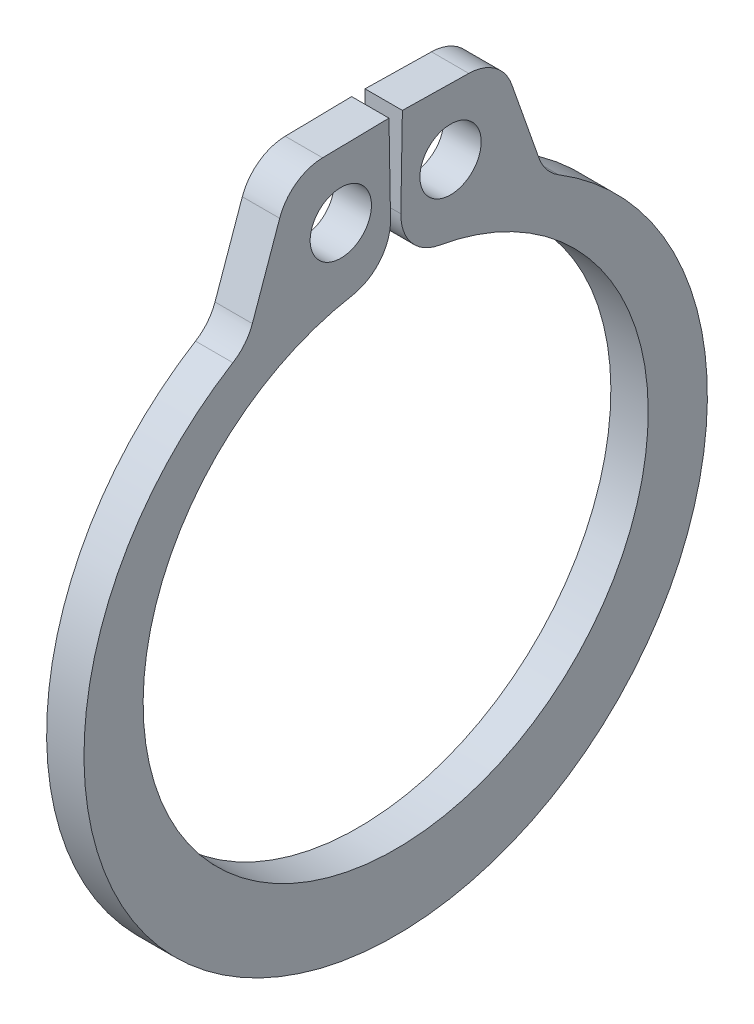
ISO-10303-21;
HEADER;
FILE_DESCRIPTION(('STEP AP214'),'2;1');
FILE_NAME('part.step','',(''),(''),'','','');
FILE_SCHEMA(('AUTOMOTIVE_DESIGN { 1 0 10303 214 1 1 1 1 }'));
ENDSEC;
DATA;
#1=APPLICATION_CONTEXT('core data for automotive mechanical design processes');
#2=APPLICATION_PROTOCOL_DEFINITION('international standard','automotive_design',2000,#1);
#3=PRODUCT_CONTEXT('',#1,'mechanical');
#4=PRODUCT('Part','Part','',(#3));
#5=PRODUCT_RELATED_PRODUCT_CATEGORY('part','',(#4));
#6=PRODUCT_DEFINITION_FORMATION('','',#4);
#7=PRODUCT_DEFINITION_CONTEXT('part definition',#1,'design');
#8=PRODUCT_DEFINITION('design','',#6,#7);
#9=PRODUCT_DEFINITION_SHAPE('','',#8);
#10=(LENGTH_UNIT() NAMED_UNIT(*) SI_UNIT(.MILLI.,.METRE.));
#11=(NAMED_UNIT(*) PLANE_ANGLE_UNIT() SI_UNIT($,.RADIAN.));
#12=(NAMED_UNIT(*) SI_UNIT($,.STERADIAN.) SOLID_ANGLE_UNIT());
#13=UNCERTAINTY_MEASURE_WITH_UNIT(LENGTH_MEASURE(1.E-05),#10,'distance_accuracy_value','');
#14=(GEOMETRIC_REPRESENTATION_CONTEXT(3) GLOBAL_UNCERTAINTY_ASSIGNED_CONTEXT((#13)) GLOBAL_UNIT_ASSIGNED_CONTEXT((#10,
#11,#12)) REPRESENTATION_CONTEXT('',''));
#15=CARTESIAN_POINT('',(0.,0.,0.));
#16=DIRECTION('',(0.,0.,1.));
#17=DIRECTION('',(1.,0.,0.));
#18=AXIS2_PLACEMENT_3D('',#15,#16,#17);
#19=CARTESIAN_POINT('',(0.3175,-0.264524901465114,0.));
#20=DIRECTION('',(1.,0.,0.));
#21=DIRECTION('',(0.,0.,-1.));
#22=AXIS2_PLACEMENT_3D('',#19,#20,#21);
#23=PLANE('',#22);
#24=CARTESIAN_POINT('',(0.3175,5.39474739325938,0.932493347387079));
#25=DIRECTION('',(1.,0.,0.));
#26=DIRECTION('',(0.,0.,-1.));
#27=AXIS2_PLACEMENT_3D('',#24,#25,#26);
#28=CIRCLE('',#27,0.5207);
#29=CARTESIAN_POINT('',(0.3175,5.39474739325938,0.411793347387079));
#30=VERTEX_POINT('',#29);
#31=EDGE_CURVE('E178',#30,#30,#28,.T.);
#32=ORIENTED_EDGE('',*,*,#31,.F.);
#33=EDGE_LOOP('',(#32));
#34=FACE_BOUND('',#33,.T.);
#35=DIRECTION('',(0.,0.943255355198257,0.332068268417521));
#36=VECTOR('',#35,1.);
#37=CARTESIAN_POINT('',(0.3175,6.49754857029043,-1.79007049490147));
#38=LINE('',#37,#36);
#39=CARTESIAN_POINT('',(0.3175,4.66344515220108,-2.43575731002226));
#40=VERTEX_POINT('',#39);
#41=CARTESIAN_POINT('',(0.3175,5.98129100900124,-1.97181635352819));
#42=VERTEX_POINT('',#41);
#43=EDGE_CURVE('E184',#40,#42,#38,.T.);
#44=ORIENTED_EDGE('',*,*,#43,.T.);
#45=CARTESIAN_POINT('',(0.3175,5.71982045444928,-1.22909708684508));
#46=DIRECTION('',(1.,0.,0.));
#47=DIRECTION('',(0.,0.,-1.));
#48=AXIS2_PLACEMENT_3D('',#45,#46,#47);
#49=CIRCLE('',#48,0.7874);
#50=CARTESIAN_POINT('',(0.3175,6.50710052961543,-1.2428391116738));
#51=VERTEX_POINT('',#50);
#52=EDGE_CURVE('E223',#42,#51,#49,.T.);
#53=ORIENTED_EDGE('',*,*,#52,.T.);
#54=DIRECTION('',(0.,0.0174524064372838,0.999847695156391));
#55=VECTOR('',#54,1.);
#56=CARTESIAN_POINT('',(0.3175,6.52680578444189,-0.113925818741299));
#57=LINE('',#56,#55);
#58=CARTESIAN_POINT('',(0.3175,6.52680578444189,-0.113925818741299));
#59=VERTEX_POINT('',#58);
#60=EDGE_CURVE('E187',#51,#59,#57,.T.);
#61=ORIENTED_EDGE('',*,*,#60,.T.);
#62=DIRECTION('',(0.,-0.999847695156391,0.0174524064372837));
#63=VECTOR('',#62,1.);
#64=CARTESIAN_POINT('',(0.3175,4.29194621622833,-0.0749161998726827));
#65=LINE('',#64,#63);
#66=CARTESIAN_POINT('',(0.3175,5.01784114958208,-0.0875867430654367));
#67=VERTEX_POINT('',#66);
#68=EDGE_CURVE('E155',#59,#67,#65,.T.);
#69=ORIENTED_EDGE('',*,*,#68,.T.);
#70=CARTESIAN_POINT('',(0.3175,5.00409912475336,-0.874866818231579));
#71=DIRECTION('',(1.,0.,0.));
#72=DIRECTION('',(0.,0.,-1.));
#73=AXIS2_PLACEMENT_3D('',#70,#71,#72);
#74=CIRCLE('',#73,0.7874);
#75=CARTESIAN_POINT('',(0.3175,4.22846376041659,-0.739262461405685));
#76=VERTEX_POINT('',#75);
#77=EDGE_CURVE('E221',#67,#76,#74,.T.);
#78=ORIENTED_EDGE('',*,*,#77,.T.);
#79=CARTESIAN_POINT('',(0.3175,0.,0.));
#80=DIRECTION('',(-1.,0.,0.));
#81=DIRECTION('',(0.,0.,-1.));
#82=AXIS2_PLACEMENT_3D('',#79,#80,#81);
#83=CIRCLE('',#82,4.2926);
#84=CARTESIAN_POINT('',(0.3175,4.22846376041659,0.739262461405685));
#85=VERTEX_POINT('',#84);
#86=EDGE_CURVE('E190',#76,#85,#83,.T.);
#87=ORIENTED_EDGE('',*,*,#86,.T.);
#88=CARTESIAN_POINT('',(0.3175,5.00409912475336,0.874866818231579));
#89=DIRECTION('',(1.,0.,0.));
#90=DIRECTION('',(0.,0.,-1.));
#91=AXIS2_PLACEMENT_3D('',#88,#89,#90);
#92=CIRCLE('',#91,0.7874);
#93=CARTESIAN_POINT('',(0.3175,5.01784114958208,0.087586743065437));
#94=VERTEX_POINT('',#93);
#95=EDGE_CURVE('E219',#85,#94,#92,.T.);
#96=ORIENTED_EDGE('',*,*,#95,.T.);
#97=DIRECTION('',(0.,0.999847695156391,0.0174524064372835));
#98=VECTOR('',#97,1.);
#99=CARTESIAN_POINT('',(0.3175,4.29194621622833,0.0749161998726831));
#100=LINE('',#99,#98);
#101=CARTESIAN_POINT('',(0.3175,6.52680578444189,0.113925818741299));
#102=VERTEX_POINT('',#101);
#103=EDGE_CURVE('E193',#94,#102,#100,.T.);
#104=ORIENTED_EDGE('',*,*,#103,.T.);
#105=DIRECTION('',(0.,-0.0174524064372838,0.999847695156391));
#106=VECTOR('',#105,1.);
#107=CARTESIAN_POINT('',(0.3175,6.52680578444189,0.113925818741299));
#108=LINE('',#107,#106);
#109=CARTESIAN_POINT('',(0.3175,6.50710052961543,1.2428391116738));
#110=VERTEX_POINT('',#109);
#111=EDGE_CURVE('E195',#102,#110,#108,.T.);
#112=ORIENTED_EDGE('',*,*,#111,.T.);
#113=CARTESIAN_POINT('',(0.3175,5.71982045444928,1.22909708684508));
#114=DIRECTION('',(1.,0.,0.));
#115=DIRECTION('',(0.,0.,-1.));
#116=AXIS2_PLACEMENT_3D('',#113,#114,#115);
#117=CIRCLE('',#116,0.7874);
#118=CARTESIAN_POINT('',(0.3175,5.98129100900124,1.97181635352819));
#119=VERTEX_POINT('',#118);
#120=EDGE_CURVE('E56',#110,#119,#117,.T.);
#121=ORIENTED_EDGE('',*,*,#120,.T.);
#122=DIRECTION('',(0.,-0.943255355198257,0.33206826841752));
#123=VECTOR('',#122,1.);
#124=CARTESIAN_POINT('',(0.3175,6.49754857029043,1.79007049490147));
#125=LINE('',#124,#123);
#126=CARTESIAN_POINT('',(0.3175,4.66344515220108,2.43575731002226));
#127=VERTEX_POINT('',#126);
#128=EDGE_CURVE('E197',#119,#127,#125,.T.);
#129=ORIENTED_EDGE('',*,*,#128,.T.);
#130=CARTESIAN_POINT('',(0.3175,4.92491570675304,3.17847657670536));
#131=DIRECTION('',(1.,0.,0.));
#132=DIRECTION('',(0.,0.,-1.));
#133=AXIS2_PLACEMENT_3D('',#130,#131,#132);
#134=CIRCLE('',#133,0.7874);
#135=CARTESIAN_POINT('',(0.3175,4.25345366496525,2.76721329553602));
#136=VERTEX_POINT('',#135);
#137=EDGE_CURVE('E11',#127,#136,#134,.F.);
#138=ORIENTED_EDGE('',*,*,#137,.T.);
#139=CARTESIAN_POINT('',(0.3175,-0.264524901465114,0.));
#140=DIRECTION('',(1.,0.,0.));
#141=DIRECTION('',(0.,0.,-1.));
#142=AXIS2_PLACEMENT_3D('',#139,#140,#141);
#143=CIRCLE('',#142,5.29807509853489);
#144=CARTESIAN_POINT('',(0.3175,4.25345366496525,-2.76721329553602));
#145=VERTEX_POINT('',#144);
#146=EDGE_CURVE('E181',#136,#145,#143,.T.);
#147=ORIENTED_EDGE('',*,*,#146,.T.);
#148=CARTESIAN_POINT('',(0.3175,4.92491570675304,-3.17847657670536));
#149=DIRECTION('',(1.,0.,0.));
#150=DIRECTION('',(0.,0.,-1.));
#151=AXIS2_PLACEMENT_3D('',#148,#149,#150);
#152=CIRCLE('',#151,0.7874);
#153=EDGE_CURVE('E243',#145,#40,#152,.F.);
#154=ORIENTED_EDGE('',*,*,#153,.T.);
#155=EDGE_LOOP('',(#44,#53,#61,#69,#78,#87,#96,#104,#112,#121,#129,#138,#147,#154));
#156=FACE_BOUND('',#155,.T.);
#157=CARTESIAN_POINT('',(0.3175,5.39474739325938,-0.932493347387079));
#158=DIRECTION('',(1.,0.,0.));
#159=DIRECTION('',(0.,0.,-1.));
#160=AXIS2_PLACEMENT_3D('',#157,#158,#159);
#161=CIRCLE('',#160,0.5207);
#162=CARTESIAN_POINT('',(0.3175,5.39474739325938,-1.45319334738708));
#163=VERTEX_POINT('',#162);
#164=EDGE_CURVE('E175',#163,#163,#161,.T.);
#165=ORIENTED_EDGE('',*,*,#164,.F.);
#166=EDGE_LOOP('',(#165));
#167=FACE_BOUND('',#166,.T.);
#168=ADVANCED_FACE('F34',(#34,#156,#167),#23,.T.);
#169=CARTESIAN_POINT('',(0.3175,-0.264524901465114,0.));
#170=DIRECTION('',(-1.,0.,0.));
#171=DIRECTION('',(0.,0.,1.));
#172=AXIS2_PLACEMENT_3D('',#169,#170,#171);
#173=CYLINDRICAL_SURFACE('',#172,5.29807509853489);
#174=CARTESIAN_POINT('',(-0.3175,-0.264524901465114,0.));
#175=DIRECTION('',(1.,0.,0.));
#176=DIRECTION('',(0.,0.,-1.));
#177=AXIS2_PLACEMENT_3D('',#174,#175,#176);
#178=CIRCLE('',#177,5.29807509853489);
#179=CARTESIAN_POINT('',(-0.3175,4.25345366496525,2.76721329553602));
#180=VERTEX_POINT('',#179);
#181=CARTESIAN_POINT('',(-0.3175,4.25345366496525,-2.76721329553602));
#182=VERTEX_POINT('',#181);
#183=EDGE_CURVE('E247',#180,#182,#178,.T.);
#184=ORIENTED_EDGE('',*,*,#183,.T.);
#185=DIRECTION('',(-1.,0.,0.));
#186=VECTOR('',#185,1.);
#187=CARTESIAN_POINT('',(0.3175,4.25345366496525,-2.76721329553602));
#188=LINE('',#187,#186);
#189=EDGE_CURVE('E208',#182,#145,#188,.F.);
#190=ORIENTED_EDGE('',*,*,#189,.T.);
#191=ORIENTED_EDGE('',*,*,#146,.F.);
#192=DIRECTION('',(-1.,0.,0.));
#193=VECTOR('',#192,1.);
#194=CARTESIAN_POINT('',(0.3175,4.25345366496525,2.76721329553602));
#195=LINE('',#194,#193);
#196=EDGE_CURVE('E205',#136,#180,#195,.T.);
#197=ORIENTED_EDGE('',*,*,#196,.T.);
#198=EDGE_LOOP('',(#184,#190,#191,#197));
#199=FACE_BOUND('',#198,.T.);
#200=ADVANCED_FACE('F257',(#199),#173,.T.);
#201=CARTESIAN_POINT('',(0.3175,6.49754857029043,-1.79007049490147));
#202=DIRECTION('',(0.,-0.332068268417521,0.943255355198257));
#203=DIRECTION('',(0.,-0.943255355198257,-0.332068268417521));
#204=AXIS2_PLACEMENT_3D('',#201,#202,#203);
#205=PLANE('',#204);
#206=ORIENTED_EDGE('',*,*,#43,.F.);
#207=DIRECTION('',(1.,0.,0.));
#208=VECTOR('',#207,1.);
#209=CARTESIAN_POINT('',(-0.3175,4.66344515220108,-2.43575731002226));
#210=LINE('',#209,#208);
#211=CARTESIAN_POINT('',(-0.3175,4.66344515220108,-2.43575731002226));
#212=VERTEX_POINT('',#211);
#213=EDGE_CURVE('E202',#40,#212,#210,.F.);
#214=ORIENTED_EDGE('',*,*,#213,.T.);
#215=DIRECTION('',(0.,0.943255355198257,0.332068268417521));
#216=VECTOR('',#215,1.);
#217=CARTESIAN_POINT('',(-0.3175,6.49754857029043,-1.79007049490147));
#218=LINE('',#217,#216);
#219=CARTESIAN_POINT('',(-0.3175,5.98129100900124,-1.97181635352819));
#220=VERTEX_POINT('',#219);
#221=EDGE_CURVE('E148',#212,#220,#218,.T.);
#222=ORIENTED_EDGE('',*,*,#221,.T.);
#223=DIRECTION('',(-1.,0.,0.));
#224=VECTOR('',#223,1.);
#225=CARTESIAN_POINT('',(0.3175,5.98129100900124,-1.97181635352819));
#226=LINE('',#225,#224);
#227=EDGE_CURVE('E156',#220,#42,#226,.F.);
#228=ORIENTED_EDGE('',*,*,#227,.T.);
#229=EDGE_LOOP('',(#206,#214,#222,#228));
#230=FACE_BOUND('',#229,.T.);
#231=ADVANCED_FACE('F265',(#230),#205,.F.);
#232=CARTESIAN_POINT('',(0.3175,6.52680578444189,-0.113925818741299));
#233=DIRECTION('',(0.,-0.999847695156391,0.0174524064372838));
#234=DIRECTION('',(0.,-0.0174524064372838,-0.999847695156391));
#235=AXIS2_PLACEMENT_3D('',#232,#233,#234);
#236=PLANE('',#235);
#237=ORIENTED_EDGE('',*,*,#60,.F.);
#238=DIRECTION('',(-1.,0.,0.));
#239=VECTOR('',#238,1.);
#240=CARTESIAN_POINT('',(0.3175,6.50710052961543,-1.2428391116738));
#241=LINE('',#240,#239);
#242=CARTESIAN_POINT('',(-0.3175,6.50710052961543,-1.2428391116738));
#243=VERTEX_POINT('',#242);
#244=EDGE_CURVE('E144',#51,#243,#241,.T.);
#245=ORIENTED_EDGE('',*,*,#244,.T.);
#246=DIRECTION('',(0.,0.0174524064372838,0.999847695156391));
#247=VECTOR('',#246,1.);
#248=CARTESIAN_POINT('',(-0.3175,6.52680578444189,-0.113925818741299));
#249=LINE('',#248,#247);
#250=CARTESIAN_POINT('',(-0.3175,6.52680578444189,-0.113925818741299));
#251=VERTEX_POINT('',#250);
#252=EDGE_CURVE('E137',#243,#251,#249,.T.);
#253=ORIENTED_EDGE('',*,*,#252,.T.);
#254=DIRECTION('',(-1.,0.,0.));
#255=VECTOR('',#254,1.);
#256=CARTESIAN_POINT('',(0.3175,6.52680578444189,-0.113925818741299));
#257=LINE('',#256,#255);
#258=EDGE_CURVE('E141',#59,#251,#257,.T.);
#259=ORIENTED_EDGE('',*,*,#258,.F.);
#260=EDGE_LOOP('',(#237,#245,#253,#259));
#261=FACE_BOUND('',#260,.T.);
#262=ADVANCED_FACE('F140',(#261),#236,.F.);
#263=CARTESIAN_POINT('',(0.3175,4.29194621622833,-0.0749161998726827));
#264=DIRECTION('',(0.,-0.0174524064372837,-0.999847695156391));
#265=DIRECTION('',(0.,0.999847695156391,-0.0174524064372837));
#266=AXIS2_PLACEMENT_3D('',#263,#264,#265);
#267=PLANE('',#266);
#268=DIRECTION('',(0.,-0.999847695156391,0.0174524064372837));
#269=VECTOR('',#268,1.);
#270=CARTESIAN_POINT('',(-0.3175,4.29194621622833,-0.0749161998726827));
#271=LINE('',#270,#269);
#272=CARTESIAN_POINT('',(-0.3175,5.01784114958208,-0.0875867430654367));
#273=VERTEX_POINT('',#272);
#274=EDGE_CURVE('E147',#251,#273,#271,.T.);
#275=ORIENTED_EDGE('',*,*,#274,.T.);
#276=DIRECTION('',(-1.,0.,0.));
#277=VECTOR('',#276,1.);
#278=CARTESIAN_POINT('',(0.3175,5.01784114958208,-0.0875867430654367));
#279=LINE('',#278,#277);
#280=EDGE_CURVE('E230',#273,#67,#279,.F.);
#281=ORIENTED_EDGE('',*,*,#280,.T.);
#282=ORIENTED_EDGE('',*,*,#68,.F.);
#283=ORIENTED_EDGE('',*,*,#258,.T.);
#284=EDGE_LOOP('',(#275,#281,#282,#283));
#285=FACE_BOUND('',#284,.T.);
#286=ADVANCED_FACE('F152',(#285),#267,.F.);
#287=CARTESIAN_POINT('',(0.3175,0.,0.));
#288=DIRECTION('',(-1.,0.,0.));
#289=DIRECTION('',(0.,0.,1.));
#290=AXIS2_PLACEMENT_3D('',#287,#288,#289);
#291=CYLINDRICAL_SURFACE('',#290,4.2926);
#292=ORIENTED_EDGE('',*,*,#86,.F.);
#293=DIRECTION('',(-1.,0.,0.));
#294=VECTOR('',#293,1.);
#295=CARTESIAN_POINT('',(0.3175,4.22846376041659,-0.739262461405685));
#296=LINE('',#295,#294);
#297=CARTESIAN_POINT('',(-0.3175,4.22846376041659,-0.739262461405685));
#298=VERTEX_POINT('',#297);
#299=EDGE_CURVE('E227',#76,#298,#296,.T.);
#300=ORIENTED_EDGE('',*,*,#299,.T.);
#301=CARTESIAN_POINT('',(-0.3175,0.,0.));
#302=DIRECTION('',(-1.,0.,0.));
#303=DIRECTION('',(0.,0.,-1.));
#304=AXIS2_PLACEMENT_3D('',#301,#302,#303);
#305=CIRCLE('',#304,4.2926);
#306=CARTESIAN_POINT('',(-0.3175,4.22846376041659,0.739262461405685));
#307=VERTEX_POINT('',#306);
#308=EDGE_CURVE('E162',#298,#307,#305,.T.);
#309=ORIENTED_EDGE('',*,*,#308,.T.);
#310=DIRECTION('',(-1.,0.,0.));
#311=VECTOR('',#310,1.);
#312=CARTESIAN_POINT('',(0.3175,4.22846376041659,0.739262461405685));
#313=LINE('',#312,#311);
#314=EDGE_CURVE('E225',#307,#85,#313,.F.);
#315=ORIENTED_EDGE('',*,*,#314,.T.);
#316=EDGE_LOOP('',(#292,#300,#309,#315));
#317=FACE_BOUND('',#316,.T.);
#318=ADVANCED_FACE('F277',(#317),#291,.F.);
#319=CARTESIAN_POINT('',(0.3175,4.29194621622833,0.0749161998726831));
#320=DIRECTION('',(0.,-0.0174524064372835,0.999847695156391));
#321=DIRECTION('',(0.,-0.999847695156391,-0.0174524064372835));
#322=AXIS2_PLACEMENT_3D('',#319,#320,#321);
#323=PLANE('',#322);
#324=ORIENTED_EDGE('',*,*,#103,.F.);
#325=DIRECTION('',(-1.,0.,0.));
#326=VECTOR('',#325,1.);
#327=CARTESIAN_POINT('',(0.3175,5.01784114958208,0.087586743065437));
#328=LINE('',#327,#326);
#329=CARTESIAN_POINT('',(-0.3175,5.01784114958208,0.087586743065437));
#330=VERTEX_POINT('',#329);
#331=EDGE_CURVE('E232',#94,#330,#328,.T.);
#332=ORIENTED_EDGE('',*,*,#331,.T.);
#333=DIRECTION('',(0.,0.999847695156391,0.0174524064372835));
#334=VECTOR('',#333,1.);
#335=CARTESIAN_POINT('',(-0.3175,4.29194621622833,0.0749161998726831));
#336=LINE('',#335,#334);
#337=CARTESIAN_POINT('',(-0.3175,6.52680578444189,0.113925818741299));
#338=VERTEX_POINT('',#337);
#339=EDGE_CURVE('E165',#330,#338,#336,.T.);
#340=ORIENTED_EDGE('',*,*,#339,.T.);
#341=DIRECTION('',(-1.,0.,0.));
#342=VECTOR('',#341,1.);
#343=CARTESIAN_POINT('',(0.3175,6.52680578444189,0.113925818741299));
#344=LINE('',#343,#342);
#345=EDGE_CURVE('E157',#102,#338,#344,.T.);
#346=ORIENTED_EDGE('',*,*,#345,.F.);
#347=EDGE_LOOP('',(#324,#332,#340,#346));
#348=FACE_BOUND('',#347,.T.);
#349=ADVANCED_FACE('F287',(#348),#323,.F.);
#350=CARTESIAN_POINT('',(0.3175,6.52680578444189,0.113925818741299));
#351=DIRECTION('',(0.,-0.999847695156391,-0.0174524064372838));
#352=DIRECTION('',(0.,0.0174524064372838,-0.999847695156391));
#353=AXIS2_PLACEMENT_3D('',#350,#351,#352);
#354=PLANE('',#353);
#355=DIRECTION('',(0.,-0.0174524064372838,0.999847695156391));
#356=VECTOR('',#355,1.);
#357=CARTESIAN_POINT('',(-0.3175,6.52680578444189,0.113925818741299));
#358=LINE('',#357,#356);
#359=CARTESIAN_POINT('',(-0.3175,6.50710052961543,1.2428391116738));
#360=VERTEX_POINT('',#359);
#361=EDGE_CURVE('E170',#338,#360,#358,.T.);
#362=ORIENTED_EDGE('',*,*,#361,.T.);
#363=DIRECTION('',(-1.,0.,0.));
#364=VECTOR('',#363,1.);
#365=CARTESIAN_POINT('',(0.3175,6.50710052961543,1.2428391116738));
#366=LINE('',#365,#364);
#367=EDGE_CURVE('E239',#360,#110,#366,.F.);
#368=ORIENTED_EDGE('',*,*,#367,.T.);
#369=ORIENTED_EDGE('',*,*,#111,.F.);
#370=ORIENTED_EDGE('',*,*,#345,.T.);
#371=EDGE_LOOP('',(#362,#368,#369,#370));
#372=FACE_BOUND('',#371,.T.);
#373=ADVANCED_FACE('F294',(#372),#354,.F.);
#374=CARTESIAN_POINT('',(0.3175,6.49754857029043,1.79007049490147));
#375=DIRECTION('',(0.,-0.33206826841752,-0.943255355198257));
#376=DIRECTION('',(0.,0.943255355198257,-0.332068268417521));
#377=AXIS2_PLACEMENT_3D('',#374,#375,#376);
#378=PLANE('',#377);
#379=ORIENTED_EDGE('',*,*,#128,.F.);
#380=DIRECTION('',(-1.,0.,0.));
#381=VECTOR('',#380,1.);
#382=CARTESIAN_POINT('',(0.3175,5.98129100900124,1.97181635352819));
#383=LINE('',#382,#381);
#384=CARTESIAN_POINT('',(-0.3175,5.98129100900124,1.97181635352819));
#385=VERTEX_POINT('',#384);
#386=EDGE_CURVE('E236',#119,#385,#383,.T.);
#387=ORIENTED_EDGE('',*,*,#386,.T.);
#388=DIRECTION('',(0.,-0.943255355198257,0.33206826841752));
#389=VECTOR('',#388,1.);
#390=CARTESIAN_POINT('',(-0.3175,6.49754857029043,1.79007049490147));
#391=LINE('',#390,#389);
#392=CARTESIAN_POINT('',(-0.3175,4.66344515220108,2.43575731002226));
#393=VERTEX_POINT('',#392);
#394=EDGE_CURVE('E173',#385,#393,#391,.T.);
#395=ORIENTED_EDGE('',*,*,#394,.T.);
#396=DIRECTION('',(1.,0.,0.));
#397=VECTOR('',#396,1.);
#398=CARTESIAN_POINT('',(0.3175,4.66344515220108,2.43575731002226));
#399=LINE('',#398,#397);
#400=EDGE_CURVE('E49',#393,#127,#399,.T.);
#401=ORIENTED_EDGE('',*,*,#400,.T.);
#402=EDGE_LOOP('',(#379,#387,#395,#401));
#403=FACE_BOUND('',#402,.T.);
#404=ADVANCED_FACE('F250',(#403),#378,.F.);
#405=CARTESIAN_POINT('',(0.3175,5.39474739325938,0.932493347387079));
#406=DIRECTION('',(-1.,0.,0.));
#407=DIRECTION('',(0.,0.,1.));
#408=AXIS2_PLACEMENT_3D('',#405,#406,#407);
#409=CYLINDRICAL_SURFACE('',#408,0.5207);
#410=ORIENTED_EDGE('',*,*,#31,.T.);
#411=EDGE_LOOP('',(#410));
#412=FACE_BOUND('',#411,.T.);
#413=CARTESIAN_POINT('',(-0.3175,5.39474739325938,0.932493347387079));
#414=DIRECTION('',(1.,0.,0.));
#415=DIRECTION('',(0.,0.,-1.));
#416=AXIS2_PLACEMENT_3D('',#413,#414,#415);
#417=CIRCLE('',#416,0.5207);
#418=CARTESIAN_POINT('',(-0.3175,5.39474739325938,0.411793347387079));
#419=VERTEX_POINT('',#418);
#420=EDGE_CURVE('E332',#419,#419,#417,.T.);
#421=ORIENTED_EDGE('',*,*,#420,.F.);
#422=EDGE_LOOP('',(#421));
#423=FACE_BOUND('',#422,.T.);
#424=ADVANCED_FACE('F301',(#412,#423),#409,.F.);
#425=CARTESIAN_POINT('',(0.3175,5.39474739325938,-0.932493347387079));
#426=DIRECTION('',(-1.,0.,0.));
#427=DIRECTION('',(0.,0.,1.));
#428=AXIS2_PLACEMENT_3D('',#425,#426,#427);
#429=CYLINDRICAL_SURFACE('',#428,0.5207);
#430=ORIENTED_EDGE('',*,*,#164,.T.);
#431=EDGE_LOOP('',(#430));
#432=FACE_BOUND('',#431,.T.);
#433=CARTESIAN_POINT('',(-0.3175,5.39474739325938,-0.932493347387079));
#434=DIRECTION('',(1.,0.,0.));
#435=DIRECTION('',(0.,0.,-1.));
#436=AXIS2_PLACEMENT_3D('',#433,#434,#435);
#437=CIRCLE('',#436,0.5207);
#438=CARTESIAN_POINT('',(-0.3175,5.39474739325938,-1.45319334738708));
#439=VERTEX_POINT('',#438);
#440=EDGE_CURVE('E329',#439,#439,#437,.T.);
#441=ORIENTED_EDGE('',*,*,#440,.F.);
#442=EDGE_LOOP('',(#441));
#443=FACE_BOUND('',#442,.T.);
#444=ADVANCED_FACE('F315',(#432,#443),#429,.F.);
#445=CARTESIAN_POINT('',(-0.3175,-0.264524901465114,0.));
#446=DIRECTION('',(1.,0.,0.));
#447=DIRECTION('',(0.,0.,-1.));
#448=AXIS2_PLACEMENT_3D('',#445,#446,#447);
#449=PLANE('',#448);
#450=ORIENTED_EDGE('',*,*,#440,.T.);
#451=EDGE_LOOP('',(#450));
#452=FACE_BOUND('',#451,.T.);
#453=ORIENTED_EDGE('',*,*,#420,.T.);
#454=EDGE_LOOP('',(#453));
#455=FACE_BOUND('',#454,.T.);
#456=ORIENTED_EDGE('',*,*,#252,.F.);
#457=CARTESIAN_POINT('',(-0.3175,5.71982045444928,-1.22909708684508));
#458=DIRECTION('',(1.,0.,0.));
#459=DIRECTION('',(0.,0.,-1.));
#460=AXIS2_PLACEMENT_3D('',#457,#458,#459);
#461=CIRCLE('',#460,0.7874);
#462=EDGE_CURVE('E216',#243,#220,#461,.F.);
#463=ORIENTED_EDGE('',*,*,#462,.T.);
#464=ORIENTED_EDGE('',*,*,#221,.F.);
#465=CARTESIAN_POINT('',(-0.3175,4.92491570675304,-3.17847657670536));
#466=DIRECTION('',(1.,0.,0.));
#467=DIRECTION('',(0.,0.,-1.));
#468=AXIS2_PLACEMENT_3D('',#465,#466,#467);
#469=CIRCLE('',#468,0.7874);
#470=EDGE_CURVE('E241',#212,#182,#469,.T.);
#471=ORIENTED_EDGE('',*,*,#470,.T.);
#472=ORIENTED_EDGE('',*,*,#183,.F.);
#473=CARTESIAN_POINT('',(-0.3175,4.92491570675304,3.17847657670536));
#474=DIRECTION('',(1.,0.,0.));
#475=DIRECTION('',(0.,0.,-1.));
#476=AXIS2_PLACEMENT_3D('',#473,#474,#475);
#477=CIRCLE('',#476,0.7874);
#478=EDGE_CURVE('E42',#180,#393,#477,.T.);
#479=ORIENTED_EDGE('',*,*,#478,.T.);
#480=ORIENTED_EDGE('',*,*,#394,.F.);
#481=CARTESIAN_POINT('',(-0.3175,5.71982045444928,1.22909708684508));
#482=DIRECTION('',(1.,0.,0.));
#483=DIRECTION('',(0.,0.,-1.));
#484=AXIS2_PLACEMENT_3D('',#481,#482,#483);
#485=CIRCLE('',#484,0.7874);
#486=EDGE_CURVE('E211',#385,#360,#485,.F.);
#487=ORIENTED_EDGE('',*,*,#486,.T.);
#488=ORIENTED_EDGE('',*,*,#361,.F.);
#489=ORIENTED_EDGE('',*,*,#339,.F.);
#490=CARTESIAN_POINT('',(-0.3175,5.00409912475336,0.874866818231579));
#491=DIRECTION('',(1.,0.,0.));
#492=DIRECTION('',(0.,0.,-1.));
#493=AXIS2_PLACEMENT_3D('',#490,#491,#492);
#494=CIRCLE('',#493,0.7874);
#495=EDGE_CURVE('E213',#330,#307,#494,.F.);
#496=ORIENTED_EDGE('',*,*,#495,.T.);
#497=ORIENTED_EDGE('',*,*,#308,.F.);
#498=CARTESIAN_POINT('',(-0.3175,5.00409912475336,-0.874866818231579));
#499=DIRECTION('',(1.,0.,0.));
#500=DIRECTION('',(0.,0.,-1.));
#501=AXIS2_PLACEMENT_3D('',#498,#499,#500);
#502=CIRCLE('',#501,0.7874);
#503=EDGE_CURVE('E161',#298,#273,#502,.F.);
#504=ORIENTED_EDGE('',*,*,#503,.T.);
#505=ORIENTED_EDGE('',*,*,#274,.F.);
#506=EDGE_LOOP('',(#456,#463,#464,#471,#472,#479,#480,#487,#488,#489,#496,#497,#504,#505));
#507=FACE_BOUND('',#506,.T.);
#508=ADVANCED_FACE('F159',(#452,#455,#507),#449,.F.);
#509=CARTESIAN_POINT('',(0.3175,4.92491570675304,-3.17847657670536));
#510=DIRECTION('',(-1.,0.,0.));
#511=DIRECTION('',(0.,0.,1.));
#512=AXIS2_PLACEMENT_3D('',#509,#510,#511);
#513=CYLINDRICAL_SURFACE('',#512,0.7874);
#514=ORIENTED_EDGE('',*,*,#153,.F.);
#515=ORIENTED_EDGE('',*,*,#189,.F.);
#516=ORIENTED_EDGE('',*,*,#470,.F.);
#517=ORIENTED_EDGE('',*,*,#213,.F.);
#518=EDGE_LOOP('',(#514,#515,#516,#517));
#519=FACE_BOUND('',#518,.T.);
#520=ADVANCED_FACE('F260',(#519),#513,.F.);
#521=CARTESIAN_POINT('',(0.3175,5.71982045444928,-1.22909708684508));
#522=DIRECTION('',(-1.,0.,0.));
#523=DIRECTION('',(0.,0.,1.));
#524=AXIS2_PLACEMENT_3D('',#521,#522,#523);
#525=CYLINDRICAL_SURFACE('',#524,0.7874);
#526=ORIENTED_EDGE('',*,*,#52,.F.);
#527=ORIENTED_EDGE('',*,*,#227,.F.);
#528=ORIENTED_EDGE('',*,*,#462,.F.);
#529=ORIENTED_EDGE('',*,*,#244,.F.);
#530=EDGE_LOOP('',(#526,#527,#528,#529));
#531=FACE_BOUND('',#530,.T.);
#532=ADVANCED_FACE('F270',(#531),#525,.T.);
#533=CARTESIAN_POINT('',(0.3175,5.00409912475336,-0.874866818231579));
#534=DIRECTION('',(-1.,0.,0.));
#535=DIRECTION('',(0.,0.,1.));
#536=AXIS2_PLACEMENT_3D('',#533,#534,#535);
#537=CYLINDRICAL_SURFACE('',#536,0.7874);
#538=ORIENTED_EDGE('',*,*,#77,.F.);
#539=ORIENTED_EDGE('',*,*,#280,.F.);
#540=ORIENTED_EDGE('',*,*,#503,.F.);
#541=ORIENTED_EDGE('',*,*,#299,.F.);
#542=EDGE_LOOP('',(#538,#539,#540,#541));
#543=FACE_BOUND('',#542,.T.);
#544=ADVANCED_FACE('F275',(#543),#537,.T.);
#545=CARTESIAN_POINT('',(0.3175,5.00409912475336,0.874866818231579));
#546=DIRECTION('',(-1.,0.,0.));
#547=DIRECTION('',(0.,0.,1.));
#548=AXIS2_PLACEMENT_3D('',#545,#546,#547);
#549=CYLINDRICAL_SURFACE('',#548,0.7874);
#550=ORIENTED_EDGE('',*,*,#95,.F.);
#551=ORIENTED_EDGE('',*,*,#314,.F.);
#552=ORIENTED_EDGE('',*,*,#495,.F.);
#553=ORIENTED_EDGE('',*,*,#331,.F.);
#554=EDGE_LOOP('',(#550,#551,#552,#553));
#555=FACE_BOUND('',#554,.T.);
#556=ADVANCED_FACE('F284',(#555),#549,.T.);
#557=CARTESIAN_POINT('',(0.3175,5.71982045444928,1.22909708684508));
#558=DIRECTION('',(-1.,0.,0.));
#559=DIRECTION('',(0.,0.,1.));
#560=AXIS2_PLACEMENT_3D('',#557,#558,#559);
#561=CYLINDRICAL_SURFACE('',#560,0.7874);
#562=ORIENTED_EDGE('',*,*,#120,.F.);
#563=ORIENTED_EDGE('',*,*,#367,.F.);
#564=ORIENTED_EDGE('',*,*,#486,.F.);
#565=ORIENTED_EDGE('',*,*,#386,.F.);
#566=EDGE_LOOP('',(#562,#563,#564,#565));
#567=FACE_BOUND('',#566,.T.);
#568=ADVANCED_FACE('F293',(#567),#561,.T.);
#569=CARTESIAN_POINT('',(0.3175,4.92491570675304,3.17847657670536));
#570=DIRECTION('',(-1.,0.,0.));
#571=DIRECTION('',(0.,0.,1.));
#572=AXIS2_PLACEMENT_3D('',#569,#570,#571);
#573=CYLINDRICAL_SURFACE('',#572,0.7874);
#574=ORIENTED_EDGE('',*,*,#137,.F.);
#575=ORIENTED_EDGE('',*,*,#400,.F.);
#576=ORIENTED_EDGE('',*,*,#478,.F.);
#577=ORIENTED_EDGE('',*,*,#196,.F.);
#578=EDGE_LOOP('',(#574,#575,#576,#577));
#579=FACE_BOUND('',#578,.T.);
#580=ADVANCED_FACE('F36',(#579),#573,.F.);
#581=CLOSED_SHELL('',(#168,#200,#231,#262,#286,#318,#349,#373,#404,#424,#444,#508,#520,#532,
#544,#556,#568,#580));
#582=MANIFOLD_SOLID_BREP('B2',#581);
#583=ADVANCED_BREP_SHAPE_REPRESENTATION('',(#18,#582),#14);
#584=SHAPE_DEFINITION_REPRESENTATION(#9,#583);
ENDSEC;
END-ISO-10303-21;
